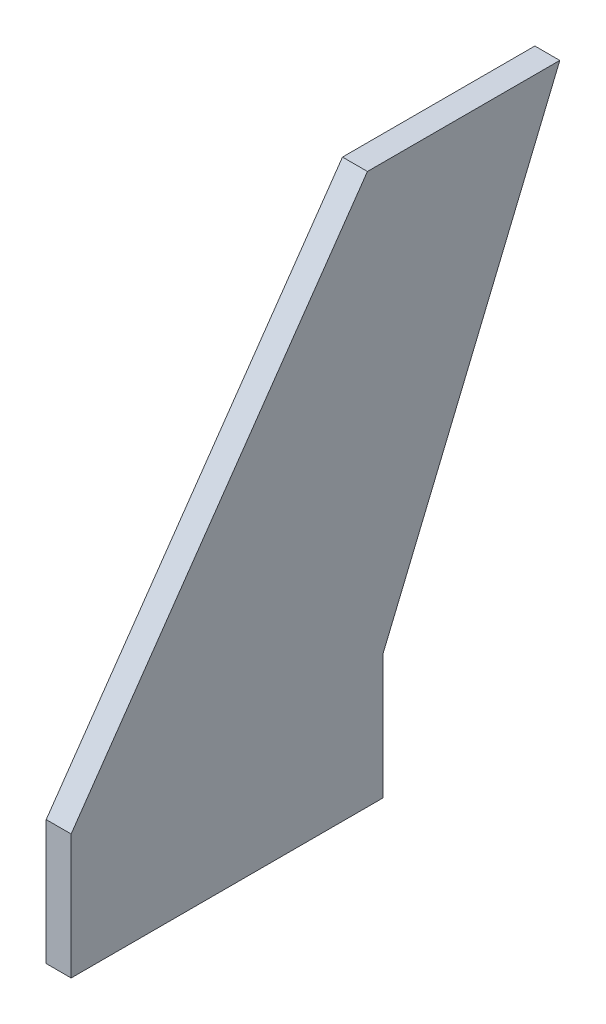
ISO-10303-21;
HEADER;
FILE_DESCRIPTION(('STEP AP214'),'2;1');
FILE_NAME('part.step','',(''),(''),'','','');
FILE_SCHEMA(('AUTOMOTIVE_DESIGN { 1 0 10303 214 1 1 1 1 }'));
ENDSEC;
DATA;
#1=APPLICATION_CONTEXT('core data for automotive mechanical design processes');
#2=APPLICATION_PROTOCOL_DEFINITION('international standard','automotive_design',2000,#1);
#3=PRODUCT_CONTEXT('',#1,'mechanical');
#4=PRODUCT('Part','Part','',(#3));
#5=PRODUCT_RELATED_PRODUCT_CATEGORY('part','',(#4));
#6=PRODUCT_DEFINITION_FORMATION('','',#4);
#7=PRODUCT_DEFINITION_CONTEXT('part definition',#1,'design');
#8=PRODUCT_DEFINITION('design','',#6,#7);
#9=PRODUCT_DEFINITION_SHAPE('','',#8);
#10=(LENGTH_UNIT() NAMED_UNIT(*) SI_UNIT(.MILLI.,.METRE.));
#11=(NAMED_UNIT(*) PLANE_ANGLE_UNIT() SI_UNIT($,.RADIAN.));
#12=(NAMED_UNIT(*) SI_UNIT($,.STERADIAN.) SOLID_ANGLE_UNIT());
#13=UNCERTAINTY_MEASURE_WITH_UNIT(LENGTH_MEASURE(1.E-05),#10,'distance_accuracy_value','');
#14=(GEOMETRIC_REPRESENTATION_CONTEXT(3) GLOBAL_UNCERTAINTY_ASSIGNED_CONTEXT((#13)) GLOBAL_UNIT_ASSIGNED_CONTEXT((#10,
#11,#12)) REPRESENTATION_CONTEXT('',''));
#15=CARTESIAN_POINT('',(0.,0.,0.));
#16=DIRECTION('',(0.,0.,1.));
#17=DIRECTION('',(1.,0.,0.));
#18=AXIS2_PLACEMENT_3D('',#15,#16,#17);
#19=CARTESIAN_POINT('',(4.,8.60297789126769,-81.777509309672));
#20=DIRECTION('',(0.,0.383750829564609,0.923436679371398));
#21=DIRECTION('',(0.,-0.923436679371398,0.383750829564609));
#22=AXIS2_PLACEMENT_3D('',#19,#20,#21);
#23=PLANE('',#22);
#24=DIRECTION('',(0.,0.923436679371398,-0.383750829564609));
#25=VECTOR('',#24,1.);
#26=CARTESIAN_POINT('',(0.,8.60297789126769,-81.777509309672));
#27=LINE('',#26,#25);
#28=CARTESIAN_POINT('',(0.,8.60297789126769,-81.777509309672));
#29=VERTEX_POINT('',#28);
#30=CARTESIAN_POINT('',(0.,76.856040612852,-110.141305144123));
#31=VERTEX_POINT('',#30);
#32=EDGE_CURVE('E117',#29,#31,#27,.T.);
#33=ORIENTED_EDGE('',*,*,#32,.T.);
#34=DIRECTION('',(-1.,0.,0.));
#35=VECTOR('',#34,1.);
#36=CARTESIAN_POINT('',(4.,76.856040612852,-110.141305144123));
#37=LINE('',#36,#35);
#38=CARTESIAN_POINT('',(4.,76.856040612852,-110.141305144123));
#39=VERTEX_POINT('',#38);
#40=EDGE_CURVE('E11',#39,#31,#37,.T.);
#41=ORIENTED_EDGE('',*,*,#40,.F.);
#42=DIRECTION('',(0.,0.923436679371398,-0.383750829564609));
#43=VECTOR('',#42,1.);
#44=CARTESIAN_POINT('',(4.,8.60297789126769,-81.777509309672));
#45=LINE('',#44,#43);
#46=CARTESIAN_POINT('',(4.,8.60297789126769,-81.777509309672));
#47=VERTEX_POINT('',#46);
#48=EDGE_CURVE('E127',#47,#39,#45,.T.);
#49=ORIENTED_EDGE('',*,*,#48,.F.);
#50=DIRECTION('',(-1.,0.,0.));
#51=VECTOR('',#50,1.);
#52=CARTESIAN_POINT('',(4.,8.60297789126769,-81.777509309672));
#53=LINE('',#52,#51);
#54=EDGE_CURVE('E113',#47,#29,#53,.T.);
#55=ORIENTED_EDGE('',*,*,#54,.T.);
#56=EDGE_LOOP('',(#33,#41,#49,#55));
#57=FACE_BOUND('',#56,.T.);
#58=ADVANCED_FACE('F33',(#57),#23,.F.);
#59=CARTESIAN_POINT('',(4.,76.856040612852,-110.141305144123));
#60=DIRECTION('',(0.,-1.,0.));
#61=DIRECTION('',(0.,0.,-1.));
#62=AXIS2_PLACEMENT_3D('',#59,#60,#61);
#63=PLANE('',#62);
#64=DIRECTION('',(0.,0.,1.));
#65=VECTOR('',#64,1.);
#66=CARTESIAN_POINT('',(0.,76.856040612852,-110.141305144123));
#67=LINE('',#66,#65);
#68=CARTESIAN_POINT('',(0.,76.856040612852,-79.2916593433676));
#69=VERTEX_POINT('',#68);
#70=EDGE_CURVE('E120',#31,#69,#67,.T.);
#71=ORIENTED_EDGE('',*,*,#70,.T.);
#72=DIRECTION('',(-1.,0.,0.));
#73=VECTOR('',#72,1.);
#74=CARTESIAN_POINT('',(4.,76.856040612852,-79.2916593433676));
#75=LINE('',#74,#73);
#76=CARTESIAN_POINT('',(4.,76.856040612852,-79.2916593433676));
#77=VERTEX_POINT('',#76);
#78=EDGE_CURVE('E41',#77,#69,#75,.T.);
#79=ORIENTED_EDGE('',*,*,#78,.F.);
#80=DIRECTION('',(0.,0.,1.));
#81=VECTOR('',#80,1.);
#82=CARTESIAN_POINT('',(4.,76.856040612852,-110.141305144123));
#83=LINE('',#82,#81);
#84=EDGE_CURVE('E86',#39,#77,#83,.T.);
#85=ORIENTED_EDGE('',*,*,#84,.F.);
#86=ORIENTED_EDGE('',*,*,#40,.T.);
#87=EDGE_LOOP('',(#71,#79,#85,#86));
#88=FACE_BOUND('',#87,.T.);
#89=ADVANCED_FACE('F151',(#88),#63,.F.);
#90=CARTESIAN_POINT('',(4.,8.60297789126769,-31.777509309672));
#91=DIRECTION('',(0.,-0.571338008732468,-0.820714858996484));
#92=DIRECTION('',(0.,0.820714858996484,-0.571338008732468));
#93=AXIS2_PLACEMENT_3D('',#90,#91,#92);
#94=PLANE('',#93);
#95=DIRECTION('',(0.,-0.820714858996484,0.571338008732468));
#96=VECTOR('',#95,1.);
#97=CARTESIAN_POINT('',(0.,8.60297789126769,-31.777509309672));
#98=LINE('',#97,#96);
#99=CARTESIAN_POINT('',(0.,8.60297789126769,-31.777509309672));
#100=VERTEX_POINT('',#99);
#101=EDGE_CURVE('E122',#69,#100,#98,.T.);
#102=ORIENTED_EDGE('',*,*,#101,.T.);
#103=DIRECTION('',(-1.,0.,0.));
#104=VECTOR('',#103,1.);
#105=CARTESIAN_POINT('',(4.,8.60297789126769,-31.777509309672));
#106=LINE('',#105,#104);
#107=CARTESIAN_POINT('',(4.,8.60297789126769,-31.777509309672));
#108=VERTEX_POINT('',#107);
#109=EDGE_CURVE('E108',#108,#100,#106,.T.);
#110=ORIENTED_EDGE('',*,*,#109,.F.);
#111=DIRECTION('',(0.,-0.820714858996484,0.571338008732468));
#112=VECTOR('',#111,1.);
#113=CARTESIAN_POINT('',(4.,8.60297789126769,-31.777509309672));
#114=LINE('',#113,#112);
#115=EDGE_CURVE('E99',#77,#108,#114,.T.);
#116=ORIENTED_EDGE('',*,*,#115,.F.);
#117=ORIENTED_EDGE('',*,*,#78,.T.);
#118=EDGE_LOOP('',(#102,#110,#116,#117));
#119=FACE_BOUND('',#118,.T.);
#120=ADVANCED_FACE('F133',(#119),#94,.F.);
#121=CARTESIAN_POINT('',(4.,-11.3970221087323,-31.777509309672));
#122=DIRECTION('',(0.,0.,-1.));
#123=DIRECTION('',(-1.,0.,0.));
#124=AXIS2_PLACEMENT_3D('',#121,#122,#123);
#125=PLANE('',#124);
#126=DIRECTION('',(0.,-1.,0.));
#127=VECTOR('',#126,1.);
#128=CARTESIAN_POINT('',(0.,-11.3970221087323,-31.777509309672));
#129=LINE('',#128,#127);
#130=CARTESIAN_POINT('',(0.,-11.3970221087323,-31.777509309672));
#131=VERTEX_POINT('',#130);
#132=EDGE_CURVE('E107',#100,#131,#129,.T.);
#133=ORIENTED_EDGE('',*,*,#132,.T.);
#134=DIRECTION('',(-1.,0.,0.));
#135=VECTOR('',#134,1.);
#136=CARTESIAN_POINT('',(4.,-11.3970221087323,-31.777509309672));
#137=LINE('',#136,#135);
#138=CARTESIAN_POINT('',(4.,-11.3970221087323,-31.777509309672));
#139=VERTEX_POINT('',#138);
#140=EDGE_CURVE('E104',#139,#131,#137,.T.);
#141=ORIENTED_EDGE('',*,*,#140,.F.);
#142=DIRECTION('',(0.,-1.,0.));
#143=VECTOR('',#142,1.);
#144=CARTESIAN_POINT('',(4.,-11.3970221087323,-31.777509309672));
#145=LINE('',#144,#143);
#146=EDGE_CURVE('E93',#108,#139,#145,.T.);
#147=ORIENTED_EDGE('',*,*,#146,.F.);
#148=ORIENTED_EDGE('',*,*,#109,.T.);
#149=EDGE_LOOP('',(#133,#141,#147,#148));
#150=FACE_BOUND('',#149,.T.);
#151=ADVANCED_FACE('F105',(#150),#125,.F.);
#152=CARTESIAN_POINT('',(4.,-11.3970221087323,-81.777509309672));
#153=DIRECTION('',(0.,1.,0.));
#154=DIRECTION('',(0.,0.,1.));
#155=AXIS2_PLACEMENT_3D('',#152,#153,#154);
#156=PLANE('',#155);
#157=DIRECTION('',(0.,0.,-1.));
#158=VECTOR('',#157,1.);
#159=CARTESIAN_POINT('',(0.,-11.3970221087323,-81.777509309672));
#160=LINE('',#159,#158);
#161=CARTESIAN_POINT('',(0.,-11.3970221087323,-81.777509309672));
#162=VERTEX_POINT('',#161);
#163=EDGE_CURVE('E72',#131,#162,#160,.T.);
#164=ORIENTED_EDGE('',*,*,#163,.T.);
#165=DIRECTION('',(-1.,0.,0.));
#166=VECTOR('',#165,1.);
#167=CARTESIAN_POINT('',(4.,-11.3970221087323,-81.777509309672));
#168=LINE('',#167,#166);
#169=CARTESIAN_POINT('',(4.,-11.3970221087323,-81.777509309672));
#170=VERTEX_POINT('',#169);
#171=EDGE_CURVE('E109',#170,#162,#168,.T.);
#172=ORIENTED_EDGE('',*,*,#171,.F.);
#173=DIRECTION('',(0.,0.,-1.));
#174=VECTOR('',#173,1.);
#175=CARTESIAN_POINT('',(4.,-11.3970221087323,-81.777509309672));
#176=LINE('',#175,#174);
#177=EDGE_CURVE('E97',#139,#170,#176,.T.);
#178=ORIENTED_EDGE('',*,*,#177,.F.);
#179=ORIENTED_EDGE('',*,*,#140,.T.);
#180=EDGE_LOOP('',(#164,#172,#178,#179));
#181=FACE_BOUND('',#180,.T.);
#182=ADVANCED_FACE('F111',(#181),#156,.F.);
#183=CARTESIAN_POINT('',(4.,8.60297789126769,-81.777509309672));
#184=DIRECTION('',(0.,0.,1.));
#185=DIRECTION('',(1.,0.,0.));
#186=AXIS2_PLACEMENT_3D('',#183,#184,#185);
#187=PLANE('',#186);
#188=DIRECTION('',(0.,1.,0.));
#189=VECTOR('',#188,1.);
#190=CARTESIAN_POINT('',(0.,8.60297789126769,-81.777509309672));
#191=LINE('',#190,#189);
#192=EDGE_CURVE('E78',#162,#29,#191,.T.);
#193=ORIENTED_EDGE('',*,*,#192,.T.);
#194=ORIENTED_EDGE('',*,*,#54,.F.);
#195=DIRECTION('',(0.,1.,0.));
#196=VECTOR('',#195,1.);
#197=CARTESIAN_POINT('',(4.,8.60297789126769,-81.777509309672));
#198=LINE('',#197,#196);
#199=EDGE_CURVE('E49',#170,#47,#198,.T.);
#200=ORIENTED_EDGE('',*,*,#199,.F.);
#201=ORIENTED_EDGE('',*,*,#171,.T.);
#202=EDGE_LOOP('',(#193,#194,#200,#201));
#203=FACE_BOUND('',#202,.T.);
#204=ADVANCED_FACE('F140',(#203),#187,.F.);
#205=CARTESIAN_POINT('',(4.,0.,0.));
#206=DIRECTION('',(1.,0.,0.));
#207=DIRECTION('',(0.,0.,-1.));
#208=AXIS2_PLACEMENT_3D('',#205,#206,#207);
#209=PLANE('',#208);
#210=ORIENTED_EDGE('',*,*,#48,.T.);
#211=ORIENTED_EDGE('',*,*,#84,.T.);
#212=ORIENTED_EDGE('',*,*,#115,.T.);
#213=ORIENTED_EDGE('',*,*,#146,.T.);
#214=ORIENTED_EDGE('',*,*,#177,.T.);
#215=ORIENTED_EDGE('',*,*,#199,.T.);
#216=EDGE_LOOP('',(#210,#211,#212,#213,#214,#215));
#217=FACE_BOUND('',#216,.T.);
#218=ADVANCED_FACE('F95',(#217),#209,.T.);
#219=CARTESIAN_POINT('',(0.,0.,0.));
#220=DIRECTION('',(1.,0.,0.));
#221=DIRECTION('',(0.,0.,-1.));
#222=AXIS2_PLACEMENT_3D('',#219,#220,#221);
#223=PLANE('',#222);
#224=ORIENTED_EDGE('',*,*,#32,.F.);
#225=ORIENTED_EDGE('',*,*,#192,.F.);
#226=ORIENTED_EDGE('',*,*,#163,.F.);
#227=ORIENTED_EDGE('',*,*,#132,.F.);
#228=ORIENTED_EDGE('',*,*,#101,.F.);
#229=ORIENTED_EDGE('',*,*,#70,.F.);
#230=EDGE_LOOP('',(#224,#225,#226,#227,#228,#229));
#231=FACE_BOUND('',#230,.T.);
#232=ADVANCED_FACE('F136',(#231),#223,.F.);
#233=CLOSED_SHELL('',(#58,#89,#120,#151,#182,#204,#218,#232));
#234=MANIFOLD_SOLID_BREP('B2',#233);
#235=ADVANCED_BREP_SHAPE_REPRESENTATION('',(#18,#234),#14);
#236=SHAPE_DEFINITION_REPRESENTATION(#9,#235);
ENDSEC;
END-ISO-10303-21;
